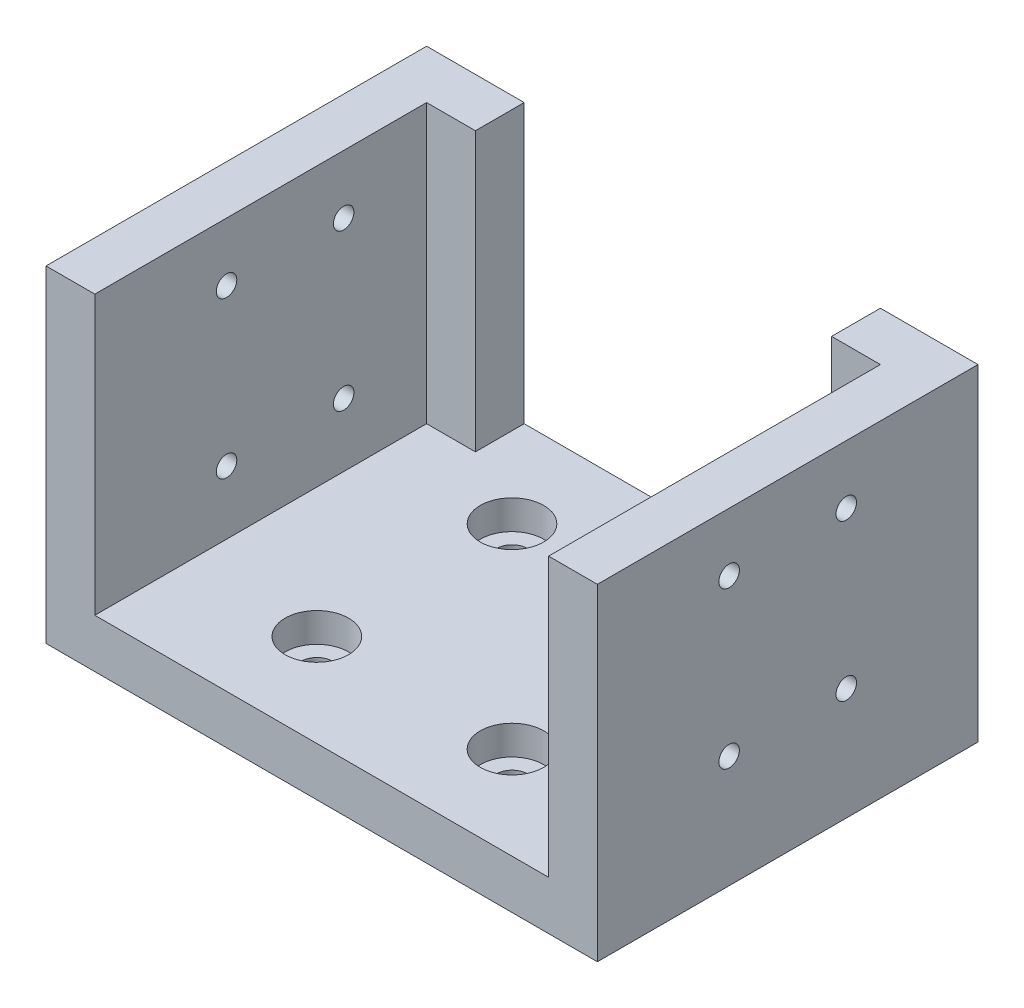
ISO-10303-21;
HEADER;
FILE_DESCRIPTION(('STEP AP214'),'2;1');
FILE_NAME('part.step','',(''),(''),'','','');
FILE_SCHEMA(('AUTOMOTIVE_DESIGN { 1 0 10303 214 1 1 1 1 }'));
ENDSEC;
DATA;
#1=APPLICATION_CONTEXT('core data for automotive mechanical design processes');
#2=APPLICATION_PROTOCOL_DEFINITION('international standard','automotive_design',2000,#1);
#3=PRODUCT_CONTEXT('',#1,'mechanical');
#4=PRODUCT('Part','Part','',(#3));
#5=PRODUCT_RELATED_PRODUCT_CATEGORY('part','',(#4));
#6=PRODUCT_DEFINITION_FORMATION('','',#4);
#7=PRODUCT_DEFINITION_CONTEXT('part definition',#1,'design');
#8=PRODUCT_DEFINITION('design','',#6,#7);
#9=PRODUCT_DEFINITION_SHAPE('','',#8);
#10=(LENGTH_UNIT() NAMED_UNIT(*) SI_UNIT(.MILLI.,.METRE.));
#11=(NAMED_UNIT(*) PLANE_ANGLE_UNIT() SI_UNIT($,.RADIAN.));
#12=(NAMED_UNIT(*) SI_UNIT($,.STERADIAN.) SOLID_ANGLE_UNIT());
#13=UNCERTAINTY_MEASURE_WITH_UNIT(LENGTH_MEASURE(1.E-05),#10,'distance_accuracy_value','');
#14=(GEOMETRIC_REPRESENTATION_CONTEXT(3) GLOBAL_UNCERTAINTY_ASSIGNED_CONTEXT((#13)) GLOBAL_UNIT_ASSIGNED_CONTEXT((#10,
#11,#12)) REPRESENTATION_CONTEXT('',''));
#15=CARTESIAN_POINT('',(0.,0.,0.));
#16=DIRECTION('',(0.,0.,1.));
#17=DIRECTION('',(1.,0.,0.));
#18=AXIS2_PLACEMENT_3D('',#15,#16,#17);
#19=CARTESIAN_POINT('',(0.,33.5,0.));
#20=DIRECTION('',(0.,1.,0.));
#21=DIRECTION('',(0.,0.,1.));
#22=AXIS2_PLACEMENT_3D('',#19,#20,#21);
#23=PLANE('',#22);
#24=DIRECTION('',(0.,0.,1.));
#25=VECTOR('',#24,1.);
#26=CARTESIAN_POINT('',(-18.25,33.5,-19.5));
#27=LINE('',#26,#25);
#28=CARTESIAN_POINT('',(-18.25,33.5,-19.5));
#29=VERTEX_POINT('',#28);
#30=CARTESIAN_POINT('',(-18.25,33.5,-14.5));
#31=VERTEX_POINT('',#30);
#32=EDGE_CURVE('E162',#29,#31,#27,.T.);
#33=ORIENTED_EDGE('',*,*,#32,.F.);
#34=DIRECTION('',(1.,0.,0.));
#35=VECTOR('',#34,1.);
#36=CARTESIAN_POINT('',(-28.25,33.5,-19.5));
#37=LINE('',#36,#35);
#38=CARTESIAN_POINT('',(-28.25,33.5,-19.5));
#39=VERTEX_POINT('',#38);
#40=EDGE_CURVE('E152',#39,#29,#37,.T.);
#41=ORIENTED_EDGE('',*,*,#40,.F.);
#42=DIRECTION('',(0.,0.,-1.));
#43=VECTOR('',#42,1.);
#44=CARTESIAN_POINT('',(-28.25,33.5,19.5));
#45=LINE('',#44,#43);
#46=CARTESIAN_POINT('',(-28.25,33.5,19.5));
#47=VERTEX_POINT('',#46);
#48=EDGE_CURVE('E248',#47,#39,#45,.T.);
#49=ORIENTED_EDGE('',*,*,#48,.F.);
#50=DIRECTION('',(1.,0.,0.));
#51=VECTOR('',#50,1.);
#52=CARTESIAN_POINT('',(-28.25,33.5,19.5));
#53=LINE('',#52,#51);
#54=CARTESIAN_POINT('',(-23.25,33.5,19.5));
#55=VERTEX_POINT('',#54);
#56=EDGE_CURVE('E245',#47,#55,#53,.T.);
#57=ORIENTED_EDGE('',*,*,#56,.T.);
#58=DIRECTION('',(0.,0.,1.));
#59=VECTOR('',#58,1.);
#60=CARTESIAN_POINT('',(-23.25,33.5,14.5));
#61=LINE('',#60,#59);
#62=CARTESIAN_POINT('',(-23.25,33.5,-14.5));
#63=VERTEX_POINT('',#62);
#64=EDGE_CURVE('E172',#63,#55,#61,.T.);
#65=ORIENTED_EDGE('',*,*,#64,.F.);
#66=DIRECTION('',(-1.,0.,0.));
#67=VECTOR('',#66,1.);
#68=CARTESIAN_POINT('',(23.25,33.5,-14.5));
#69=LINE('',#68,#67);
#70=EDGE_CURVE('E182',#31,#63,#69,.T.);
#71=ORIENTED_EDGE('',*,*,#70,.F.);
#72=EDGE_LOOP('',(#33,#41,#49,#57,#65,#71));
#73=FACE_BOUND('',#72,.T.);
#74=ADVANCED_FACE('F43',(#73),#23,.T.);
#75=CARTESIAN_POINT('',(23.25,5.,-14.5));
#76=DIRECTION('',(0.,0.,-1.));
#77=DIRECTION('',(-1.,0.,0.));
#78=AXIS2_PLACEMENT_3D('',#75,#76,#77);
#79=PLANE('',#78);
#80=DIRECTION('',(-1.,0.,0.));
#81=VECTOR('',#80,1.);
#82=CARTESIAN_POINT('',(23.25,5.,-14.5));
#83=LINE('',#82,#81);
#84=CARTESIAN_POINT('',(-18.25,5.,-14.5));
#85=VERTEX_POINT('',#84);
#86=CARTESIAN_POINT('',(-23.25,5.,-14.5));
#87=VERTEX_POINT('',#86);
#88=EDGE_CURVE('E171',#85,#87,#83,.T.);
#89=ORIENTED_EDGE('',*,*,#88,.F.);
#90=DIRECTION('',(0.,-1.,0.));
#91=VECTOR('',#90,1.);
#92=CARTESIAN_POINT('',(-18.25,33.5,-14.5));
#93=LINE('',#92,#91);
#94=EDGE_CURVE('E60',#31,#85,#93,.T.);
#95=ORIENTED_EDGE('',*,*,#94,.F.);
#96=ORIENTED_EDGE('',*,*,#70,.T.);
#97=DIRECTION('',(0.,1.,0.));
#98=VECTOR('',#97,1.);
#99=CARTESIAN_POINT('',(-23.25,5.,-14.5));
#100=LINE('',#99,#98);
#101=EDGE_CURVE('E192',#87,#63,#100,.T.);
#102=ORIENTED_EDGE('',*,*,#101,.F.);
#103=EDGE_LOOP('',(#89,#95,#96,#102));
#104=FACE_BOUND('',#103,.T.);
#105=ADVANCED_FACE('F321',(#104),#79,.F.);
#106=CARTESIAN_POINT('',(-28.25,11.5,6.));
#107=DIRECTION('',(1.,0.,0.));
#108=DIRECTION('',(0.,0.,-1.));
#109=AXIS2_PLACEMENT_3D('',#106,#107,#108);
#110=CYLINDRICAL_SURFACE('',#109,1.05);
#111=CARTESIAN_POINT('',(-23.25,11.5,6.));
#112=DIRECTION('',(-1.,0.,0.));
#113=DIRECTION('',(0.,0.,1.));
#114=AXIS2_PLACEMENT_3D('',#111,#112,#113);
#115=CIRCLE('',#114,1.05);
#116=CARTESIAN_POINT('',(-23.25,11.5,7.05));
#117=VERTEX_POINT('',#116);
#118=EDGE_CURVE('E211',#117,#117,#115,.F.);
#119=ORIENTED_EDGE('',*,*,#118,.T.);
#120=EDGE_LOOP('',(#119));
#121=FACE_BOUND('',#120,.T.);
#122=CARTESIAN_POINT('',(-28.25,11.5,6.));
#123=DIRECTION('',(1.,0.,0.));
#124=DIRECTION('',(0.,0.,-1.));
#125=AXIS2_PLACEMENT_3D('',#122,#123,#124);
#126=CIRCLE('',#125,1.05);
#127=CARTESIAN_POINT('',(-28.25,11.5,4.95));
#128=VERTEX_POINT('',#127);
#129=EDGE_CURVE('E233',#128,#128,#126,.T.);
#130=ORIENTED_EDGE('',*,*,#129,.F.);
#131=EDGE_LOOP('',(#130));
#132=FACE_BOUND('',#131,.T.);
#133=ADVANCED_FACE('F291',(#121,#132),#110,.F.);
#134=CARTESIAN_POINT('',(-28.25,11.5,-6.));
#135=DIRECTION('',(1.,0.,0.));
#136=DIRECTION('',(0.,0.,-1.));
#137=AXIS2_PLACEMENT_3D('',#134,#135,#136);
#138=CYLINDRICAL_SURFACE('',#137,1.05);
#139=CARTESIAN_POINT('',(-23.25,11.5,-6.));
#140=DIRECTION('',(-1.,0.,0.));
#141=DIRECTION('',(0.,0.,1.));
#142=AXIS2_PLACEMENT_3D('',#139,#140,#141);
#143=CIRCLE('',#142,1.05);
#144=CARTESIAN_POINT('',(-23.25,11.5,-4.95));
#145=VERTEX_POINT('',#144);
#146=EDGE_CURVE('E208',#145,#145,#143,.F.);
#147=ORIENTED_EDGE('',*,*,#146,.T.);
#148=EDGE_LOOP('',(#147));
#149=FACE_BOUND('',#148,.T.);
#150=CARTESIAN_POINT('',(-28.25,11.5,-6.));
#151=DIRECTION('',(1.,0.,0.));
#152=DIRECTION('',(0.,0.,1.));
#153=AXIS2_PLACEMENT_3D('',#150,#151,#152);
#154=CIRCLE('',#153,1.05);
#155=CARTESIAN_POINT('',(-28.25,11.5,-4.95));
#156=VERTEX_POINT('',#155);
#157=EDGE_CURVE('E219',#156,#156,#154,.T.);
#158=ORIENTED_EDGE('',*,*,#157,.F.);
#159=EDGE_LOOP('',(#158));
#160=FACE_BOUND('',#159,.T.);
#161=ADVANCED_FACE('F336',(#149,#160),#138,.F.);
#162=CARTESIAN_POINT('',(-28.25,27.5,-6.));
#163=DIRECTION('',(1.,0.,0.));
#164=DIRECTION('',(0.,0.,-1.));
#165=AXIS2_PLACEMENT_3D('',#162,#163,#164);
#166=CYLINDRICAL_SURFACE('',#165,1.05);
#167=CARTESIAN_POINT('',(-23.25,27.5,-6.));
#168=DIRECTION('',(-1.,0.,0.));
#169=DIRECTION('',(0.,0.,1.));
#170=AXIS2_PLACEMENT_3D('',#167,#168,#169);
#171=CIRCLE('',#170,1.05);
#172=CARTESIAN_POINT('',(-23.25,27.5,-4.95));
#173=VERTEX_POINT('',#172);
#174=EDGE_CURVE('E205',#173,#173,#171,.F.);
#175=ORIENTED_EDGE('',*,*,#174,.T.);
#176=EDGE_LOOP('',(#175));
#177=FACE_BOUND('',#176,.T.);
#178=CARTESIAN_POINT('',(-28.25,27.5,-6.));
#179=DIRECTION('',(1.,0.,0.));
#180=DIRECTION('',(0.,0.,-1.));
#181=AXIS2_PLACEMENT_3D('',#178,#179,#180);
#182=CIRCLE('',#181,1.05);
#183=CARTESIAN_POINT('',(-28.25,27.5,-7.05));
#184=VERTEX_POINT('',#183);
#185=EDGE_CURVE('E225',#184,#184,#182,.T.);
#186=ORIENTED_EDGE('',*,*,#185,.F.);
#187=EDGE_LOOP('',(#186));
#188=FACE_BOUND('',#187,.T.);
#189=ADVANCED_FACE('F467',(#177,#188),#166,.F.);
#190=CARTESIAN_POINT('',(-28.25,27.5,6.));
#191=DIRECTION('',(1.,0.,0.));
#192=DIRECTION('',(0.,0.,-1.));
#193=AXIS2_PLACEMENT_3D('',#190,#191,#192);
#194=CYLINDRICAL_SURFACE('',#193,1.05);
#195=CARTESIAN_POINT('',(-23.25,27.5,6.));
#196=DIRECTION('',(-1.,0.,0.));
#197=DIRECTION('',(0.,0.,1.));
#198=AXIS2_PLACEMENT_3D('',#195,#196,#197);
#199=CIRCLE('',#198,1.05);
#200=CARTESIAN_POINT('',(-23.25,27.5,7.05));
#201=VERTEX_POINT('',#200);
#202=EDGE_CURVE('E47',#201,#201,#199,.F.);
#203=ORIENTED_EDGE('',*,*,#202,.T.);
#204=EDGE_LOOP('',(#203));
#205=FACE_BOUND('',#204,.T.);
#206=CARTESIAN_POINT('',(-28.25,27.5,6.));
#207=DIRECTION('',(1.,0.,0.));
#208=DIRECTION('',(0.,0.,1.));
#209=AXIS2_PLACEMENT_3D('',#206,#207,#208);
#210=CIRCLE('',#209,1.05);
#211=CARTESIAN_POINT('',(-28.25,27.5,7.05));
#212=VERTEX_POINT('',#211);
#213=EDGE_CURVE('E214',#212,#212,#210,.T.);
#214=ORIENTED_EDGE('',*,*,#213,.F.);
#215=EDGE_LOOP('',(#214));
#216=FACE_BOUND('',#215,.T.);
#217=ADVANCED_FACE('F347',(#205,#216),#194,.F.);
#218=CARTESIAN_POINT('',(-28.25,33.5,-19.5));
#219=DIRECTION('',(0.,0.,-1.));
#220=DIRECTION('',(-1.,0.,0.));
#221=AXIS2_PLACEMENT_3D('',#218,#219,#220);
#222=PLANE('',#221);
#223=DIRECTION('',(0.,-1.,0.));
#224=VECTOR('',#223,1.);
#225=CARTESIAN_POINT('',(-18.25,33.5,-19.5));
#226=LINE('',#225,#224);
#227=CARTESIAN_POINT('',(-18.25,5.,-19.5));
#228=VERTEX_POINT('',#227);
#229=EDGE_CURVE('E135',#29,#228,#226,.T.);
#230=ORIENTED_EDGE('',*,*,#229,.T.);
#231=DIRECTION('',(1.,0.,0.));
#232=VECTOR('',#231,1.);
#233=CARTESIAN_POINT('',(-18.25,5.,-19.5));
#234=LINE('',#233,#232);
#235=CARTESIAN_POINT('',(18.25,5.,-19.5));
#236=VERTEX_POINT('',#235);
#237=EDGE_CURVE('E143',#228,#236,#234,.T.);
#238=ORIENTED_EDGE('',*,*,#237,.T.);
#239=DIRECTION('',(0.,1.,0.));
#240=VECTOR('',#239,1.);
#241=CARTESIAN_POINT('',(18.25,33.5,-19.5));
#242=LINE('',#241,#240);
#243=CARTESIAN_POINT('',(18.25,33.5,-19.5));
#244=VERTEX_POINT('',#243);
#245=EDGE_CURVE('E140',#236,#244,#242,.T.);
#246=ORIENTED_EDGE('',*,*,#245,.T.);
#247=CARTESIAN_POINT('',(28.25,33.5,-19.5));
#248=VERTEX_POINT('',#247);
#249=EDGE_CURVE('E241',#244,#248,#37,.T.);
#250=ORIENTED_EDGE('',*,*,#249,.T.);
#251=DIRECTION('',(0.,-1.,0.));
#252=VECTOR('',#251,1.);
#253=CARTESIAN_POINT('',(28.25,33.5,-19.5));
#254=LINE('',#253,#252);
#255=CARTESIAN_POINT('',(28.25,0.,-19.5));
#256=VERTEX_POINT('',#255);
#257=EDGE_CURVE('E251',#248,#256,#254,.T.);
#258=ORIENTED_EDGE('',*,*,#257,.T.);
#259=DIRECTION('',(1.,0.,0.));
#260=VECTOR('',#259,1.);
#261=CARTESIAN_POINT('',(-28.25,0.,-19.5));
#262=LINE('',#261,#260);
#263=CARTESIAN_POINT('',(-28.25,0.,-19.5));
#264=VERTEX_POINT('',#263);
#265=EDGE_CURVE('E236',#264,#256,#262,.T.);
#266=ORIENTED_EDGE('',*,*,#265,.F.);
#267=DIRECTION('',(0.,-1.,0.));
#268=VECTOR('',#267,1.);
#269=CARTESIAN_POINT('',(-28.25,33.5,-19.5));
#270=LINE('',#269,#268);
#271=EDGE_CURVE('E11',#39,#264,#270,.T.);
#272=ORIENTED_EDGE('',*,*,#271,.F.);
#273=ORIENTED_EDGE('',*,*,#40,.T.);
#274=EDGE_LOOP('',(#230,#238,#246,#250,#258,#266,#272,#273));
#275=FACE_BOUND('',#274,.T.);
#276=ADVANCED_FACE('F45',(#275),#222,.T.);
#277=CARTESIAN_POINT('',(-28.25,33.5,19.5));
#278=DIRECTION('',(-1.,0.,0.));
#279=DIRECTION('',(0.,0.,1.));
#280=AXIS2_PLACEMENT_3D('',#277,#278,#279);
#281=PLANE('',#280);
#282=ORIENTED_EDGE('',*,*,#213,.T.);
#283=EDGE_LOOP('',(#282));
#284=FACE_BOUND('',#283,.T.);
#285=ORIENTED_EDGE('',*,*,#185,.T.);
#286=EDGE_LOOP('',(#285));
#287=FACE_BOUND('',#286,.T.);
#288=ORIENTED_EDGE('',*,*,#157,.T.);
#289=EDGE_LOOP('',(#288));
#290=FACE_BOUND('',#289,.T.);
#291=ORIENTED_EDGE('',*,*,#129,.T.);
#292=EDGE_LOOP('',(#291));
#293=FACE_BOUND('',#292,.T.);
#294=DIRECTION('',(0.,0.,-1.));
#295=VECTOR('',#294,1.);
#296=CARTESIAN_POINT('',(-28.25,0.,19.5));
#297=LINE('',#296,#295);
#298=CARTESIAN_POINT('',(-28.25,0.,19.5));
#299=VERTEX_POINT('',#298);
#300=EDGE_CURVE('E259',#299,#264,#297,.T.);
#301=ORIENTED_EDGE('',*,*,#300,.F.);
#302=DIRECTION('',(0.,-1.,0.));
#303=VECTOR('',#302,1.);
#304=CARTESIAN_POINT('',(-28.25,33.5,19.5));
#305=LINE('',#304,#303);
#306=EDGE_CURVE('E52',#47,#299,#305,.T.);
#307=ORIENTED_EDGE('',*,*,#306,.F.);
#308=ORIENTED_EDGE('',*,*,#48,.T.);
#309=ORIENTED_EDGE('',*,*,#271,.T.);
#310=EDGE_LOOP('',(#301,#307,#308,#309));
#311=FACE_BOUND('',#310,.T.);
#312=ADVANCED_FACE('F315',(#284,#287,#290,#293,#311),#281,.T.);
#313=CARTESIAN_POINT('',(-28.25,33.5,19.5));
#314=DIRECTION('',(0.,0.,-1.));
#315=DIRECTION('',(-1.,0.,0.));
#316=AXIS2_PLACEMENT_3D('',#313,#314,#315);
#317=PLANE('',#316);
#318=DIRECTION('',(1.,0.,0.));
#319=VECTOR('',#318,1.);
#320=CARTESIAN_POINT('',(-23.25,5.,19.5));
#321=LINE('',#320,#319);
#322=CARTESIAN_POINT('',(-23.25,5.,19.5));
#323=VERTEX_POINT('',#322);
#324=CARTESIAN_POINT('',(23.25,5.,19.5));
#325=VERTEX_POINT('',#324);
#326=EDGE_CURVE('E177',#323,#325,#321,.T.);
#327=ORIENTED_EDGE('',*,*,#326,.F.);
#328=DIRECTION('',(0.,1.,0.));
#329=VECTOR('',#328,1.);
#330=CARTESIAN_POINT('',(-23.25,5.,19.5));
#331=LINE('',#330,#329);
#332=EDGE_CURVE('E189',#323,#55,#331,.T.);
#333=ORIENTED_EDGE('',*,*,#332,.T.);
#334=ORIENTED_EDGE('',*,*,#56,.F.);
#335=ORIENTED_EDGE('',*,*,#306,.T.);
#336=DIRECTION('',(1.,0.,0.));
#337=VECTOR('',#336,1.);
#338=CARTESIAN_POINT('',(-28.25,0.,19.5));
#339=LINE('',#338,#337);
#340=CARTESIAN_POINT('',(28.25,0.,19.5));
#341=VERTEX_POINT('',#340);
#342=EDGE_CURVE('E257',#299,#341,#339,.T.);
#343=ORIENTED_EDGE('',*,*,#342,.T.);
#344=DIRECTION('',(0.,-1.,0.));
#345=VECTOR('',#344,1.);
#346=CARTESIAN_POINT('',(28.25,33.5,19.5));
#347=LINE('',#346,#345);
#348=CARTESIAN_POINT('',(28.25,33.5,19.5));
#349=VERTEX_POINT('',#348);
#350=EDGE_CURVE('E263',#349,#341,#347,.T.);
#351=ORIENTED_EDGE('',*,*,#350,.F.);
#352=CARTESIAN_POINT('',(23.25,33.5,19.5));
#353=VERTEX_POINT('',#352);
#354=EDGE_CURVE('E244',#353,#349,#53,.T.);
#355=ORIENTED_EDGE('',*,*,#354,.F.);
#356=DIRECTION('',(0.,1.,0.));
#357=VECTOR('',#356,1.);
#358=CARTESIAN_POINT('',(23.25,5.,19.5));
#359=LINE('',#358,#357);
#360=EDGE_CURVE('E68',#325,#353,#359,.T.);
#361=ORIENTED_EDGE('',*,*,#360,.F.);
#362=EDGE_LOOP('',(#327,#333,#334,#335,#343,#351,#355,#361));
#363=FACE_BOUND('',#362,.T.);
#364=ADVANCED_FACE('F298',(#363),#317,.F.);
#365=CARTESIAN_POINT('',(28.25,33.5,19.5));
#366=DIRECTION('',(-1.,0.,0.));
#367=DIRECTION('',(0.,0.,1.));
#368=AXIS2_PLACEMENT_3D('',#365,#366,#367);
#369=PLANE('',#368);
#370=CARTESIAN_POINT('',(28.25,27.5,6.));
#371=DIRECTION('',(1.,0.,0.));
#372=DIRECTION('',(0.,0.,1.));
#373=AXIS2_PLACEMENT_3D('',#370,#371,#372);
#374=CIRCLE('',#373,1.05);
#375=CARTESIAN_POINT('',(28.25,27.5,7.05));
#376=VERTEX_POINT('',#375);
#377=EDGE_CURVE('E228',#376,#376,#374,.T.);
#378=ORIENTED_EDGE('',*,*,#377,.F.);
#379=EDGE_LOOP('',(#378));
#380=FACE_BOUND('',#379,.T.);
#381=CARTESIAN_POINT('',(28.25,27.5,-6.));
#382=DIRECTION('',(1.,0.,0.));
#383=DIRECTION('',(0.,0.,-1.));
#384=AXIS2_PLACEMENT_3D('',#381,#382,#383);
#385=CIRCLE('',#384,1.05);
#386=CARTESIAN_POINT('',(28.25,27.5,-7.05));
#387=VERTEX_POINT('',#386);
#388=EDGE_CURVE('E222',#387,#387,#385,.T.);
#389=ORIENTED_EDGE('',*,*,#388,.F.);
#390=EDGE_LOOP('',(#389));
#391=FACE_BOUND('',#390,.T.);
#392=CARTESIAN_POINT('',(28.25,11.5,-6.));
#393=DIRECTION('',(1.,0.,0.));
#394=DIRECTION('',(0.,0.,1.));
#395=AXIS2_PLACEMENT_3D('',#392,#393,#394);
#396=CIRCLE('',#395,1.05);
#397=CARTESIAN_POINT('',(28.25,11.5,-4.95));
#398=VERTEX_POINT('',#397);
#399=EDGE_CURVE('E215',#398,#398,#396,.T.);
#400=ORIENTED_EDGE('',*,*,#399,.F.);
#401=EDGE_LOOP('',(#400));
#402=FACE_BOUND('',#401,.T.);
#403=CARTESIAN_POINT('',(28.25,11.5,6.));
#404=DIRECTION('',(1.,0.,0.));
#405=DIRECTION('',(0.,0.,-1.));
#406=AXIS2_PLACEMENT_3D('',#403,#404,#405);
#407=CIRCLE('',#406,1.05);
#408=CARTESIAN_POINT('',(28.25,11.5,4.95));
#409=VERTEX_POINT('',#408);
#410=EDGE_CURVE('E218',#409,#409,#407,.T.);
#411=ORIENTED_EDGE('',*,*,#410,.F.);
#412=EDGE_LOOP('',(#411));
#413=FACE_BOUND('',#412,.T.);
#414=DIRECTION('',(0.,0.,-1.));
#415=VECTOR('',#414,1.);
#416=CARTESIAN_POINT('',(28.25,0.,19.5));
#417=LINE('',#416,#415);
#418=EDGE_CURVE('E254',#341,#256,#417,.T.);
#419=ORIENTED_EDGE('',*,*,#418,.T.);
#420=ORIENTED_EDGE('',*,*,#257,.F.);
#421=DIRECTION('',(0.,0.,-1.));
#422=VECTOR('',#421,1.);
#423=CARTESIAN_POINT('',(28.25,33.5,19.5));
#424=LINE('',#423,#422);
#425=EDGE_CURVE('E240',#349,#248,#424,.T.);
#426=ORIENTED_EDGE('',*,*,#425,.F.);
#427=ORIENTED_EDGE('',*,*,#350,.T.);
#428=EDGE_LOOP('',(#419,#420,#426,#427));
#429=FACE_BOUND('',#428,.T.);
#430=ADVANCED_FACE('F294',(#380,#391,#402,#413,#429),#369,.F.);
#431=DIRECTION('',(0.,0.,1.));
#432=VECTOR('',#431,1.);
#433=CARTESIAN_POINT('',(18.25,33.5,-19.5));
#434=LINE('',#433,#432);
#435=CARTESIAN_POINT('',(18.25,33.5,-14.5));
#436=VERTEX_POINT('',#435);
#437=EDGE_CURVE('E165',#244,#436,#434,.T.);
#438=ORIENTED_EDGE('',*,*,#437,.T.);
#439=CARTESIAN_POINT('',(23.25,33.5,-14.5));
#440=VERTEX_POINT('',#439);
#441=EDGE_CURVE('E183',#440,#436,#69,.T.);
#442=ORIENTED_EDGE('',*,*,#441,.F.);
#443=DIRECTION('',(0.,0.,-1.));
#444=VECTOR('',#443,1.);
#445=CARTESIAN_POINT('',(23.25,33.5,14.5));
#446=LINE('',#445,#444);
#447=EDGE_CURVE('E164',#353,#440,#446,.T.);
#448=ORIENTED_EDGE('',*,*,#447,.F.);
#449=ORIENTED_EDGE('',*,*,#354,.T.);
#450=ORIENTED_EDGE('',*,*,#425,.T.);
#451=ORIENTED_EDGE('',*,*,#249,.F.);
#452=EDGE_LOOP('',(#438,#442,#448,#449,#450,#451));
#453=FACE_BOUND('',#452,.T.);
#454=ADVANCED_FACE('F297',(#453),#23,.T.);
#455=CARTESIAN_POINT('',(0.,0.,0.));
#456=DIRECTION('',(0.,1.,0.));
#457=DIRECTION('',(0.,0.,1.));
#458=AXIS2_PLACEMENT_3D('',#455,#456,#457);
#459=PLANE('',#458);
#460=CARTESIAN_POINT('',(10.,0.,-10.));
#461=DIRECTION('',(0.,1.,0.));
#462=DIRECTION('',(0.,0.,1.));
#463=AXIS2_PLACEMENT_3D('',#460,#461,#462);
#464=CIRCLE('',#463,1.6);
#465=CARTESIAN_POINT('',(10.,0.,-8.4));
#466=VERTEX_POINT('',#465);
#467=EDGE_CURVE('E369',#466,#466,#464,.T.);
#468=ORIENTED_EDGE('',*,*,#467,.T.);
#469=EDGE_LOOP('',(#468));
#470=FACE_BOUND('',#469,.T.);
#471=CARTESIAN_POINT('',(10.,0.,10.));
#472=DIRECTION('',(0.,1.,0.));
#473=DIRECTION('',(0.,0.,1.));
#474=AXIS2_PLACEMENT_3D('',#471,#472,#473);
#475=CIRCLE('',#474,1.6);
#476=CARTESIAN_POINT('',(10.,0.,11.6));
#477=VERTEX_POINT('',#476);
#478=EDGE_CURVE('E373',#477,#477,#475,.T.);
#479=ORIENTED_EDGE('',*,*,#478,.T.);
#480=EDGE_LOOP('',(#479));
#481=FACE_BOUND('',#480,.T.);
#482=CARTESIAN_POINT('',(-10.,0.,10.));
#483=DIRECTION('',(0.,1.,0.));
#484=DIRECTION('',(0.,0.,1.));
#485=AXIS2_PLACEMENT_3D('',#482,#483,#484);
#486=CIRCLE('',#485,1.6);
#487=CARTESIAN_POINT('',(-10.,0.,11.6));
#488=VERTEX_POINT('',#487);
#489=EDGE_CURVE('E377',#488,#488,#486,.T.);
#490=ORIENTED_EDGE('',*,*,#489,.T.);
#491=EDGE_LOOP('',(#490));
#492=FACE_BOUND('',#491,.T.);
#493=CARTESIAN_POINT('',(-10.,0.,-10.));
#494=DIRECTION('',(0.,1.,0.));
#495=DIRECTION('',(0.,0.,1.));
#496=AXIS2_PLACEMENT_3D('',#493,#494,#495);
#497=CIRCLE('',#496,1.6);
#498=CARTESIAN_POINT('',(-10.,0.,-8.4));
#499=VERTEX_POINT('',#498);
#500=EDGE_CURVE('E157',#499,#499,#497,.T.);
#501=ORIENTED_EDGE('',*,*,#500,.T.);
#502=EDGE_LOOP('',(#501));
#503=FACE_BOUND('',#502,.T.);
#504=ORIENTED_EDGE('',*,*,#265,.T.);
#505=ORIENTED_EDGE('',*,*,#418,.F.);
#506=ORIENTED_EDGE('',*,*,#342,.F.);
#507=ORIENTED_EDGE('',*,*,#300,.T.);
#508=EDGE_LOOP('',(#504,#505,#506,#507));
#509=FACE_BOUND('',#508,.T.);
#510=ADVANCED_FACE('F289',(#470,#481,#492,#503,#509),#459,.F.);
#511=CARTESIAN_POINT('',(23.25,11.5,6.));
#512=DIRECTION('',(1.,0.,0.));
#513=DIRECTION('',(0.,0.,-1.));
#514=AXIS2_PLACEMENT_3D('',#511,#512,#513);
#515=CIRCLE('',#514,1.05);
#516=CARTESIAN_POINT('',(23.25,11.5,4.95));
#517=VERTEX_POINT('',#516);
#518=EDGE_CURVE('E202',#517,#517,#515,.F.);
#519=ORIENTED_EDGE('',*,*,#518,.T.);
#520=EDGE_LOOP('',(#519));
#521=FACE_BOUND('',#520,.T.);
#522=ORIENTED_EDGE('',*,*,#410,.T.);
#523=EDGE_LOOP('',(#522));
#524=FACE_BOUND('',#523,.T.);
#525=ADVANCED_FACE('F285',(#521,#524),#110,.F.);
#526=CARTESIAN_POINT('',(23.25,11.5,-6.));
#527=DIRECTION('',(1.,0.,0.));
#528=DIRECTION('',(0.,0.,-1.));
#529=AXIS2_PLACEMENT_3D('',#526,#527,#528);
#530=CIRCLE('',#529,1.05);
#531=CARTESIAN_POINT('',(23.25,11.5,-7.05));
#532=VERTEX_POINT('',#531);
#533=EDGE_CURVE('E199',#532,#532,#530,.F.);
#534=ORIENTED_EDGE('',*,*,#533,.T.);
#535=EDGE_LOOP('',(#534));
#536=FACE_BOUND('',#535,.T.);
#537=ORIENTED_EDGE('',*,*,#399,.T.);
#538=EDGE_LOOP('',(#537));
#539=FACE_BOUND('',#538,.T.);
#540=ADVANCED_FACE('F288',(#536,#539),#138,.F.);
#541=CARTESIAN_POINT('',(23.25,27.5,-6.));
#542=DIRECTION('',(1.,0.,0.));
#543=DIRECTION('',(0.,0.,-1.));
#544=AXIS2_PLACEMENT_3D('',#541,#542,#543);
#545=CIRCLE('',#544,1.05);
#546=CARTESIAN_POINT('',(23.25,27.5,-7.05));
#547=VERTEX_POINT('',#546);
#548=EDGE_CURVE('E196',#547,#547,#545,.F.);
#549=ORIENTED_EDGE('',*,*,#548,.T.);
#550=EDGE_LOOP('',(#549));
#551=FACE_BOUND('',#550,.T.);
#552=ORIENTED_EDGE('',*,*,#388,.T.);
#553=EDGE_LOOP('',(#552));
#554=FACE_BOUND('',#553,.T.);
#555=ADVANCED_FACE('F462',(#551,#554),#166,.F.);
#556=CARTESIAN_POINT('',(23.25,27.5,6.));
#557=DIRECTION('',(1.,0.,0.));
#558=DIRECTION('',(0.,0.,-1.));
#559=AXIS2_PLACEMENT_3D('',#556,#557,#558);
#560=CIRCLE('',#559,1.05);
#561=CARTESIAN_POINT('',(23.25,27.5,4.95));
#562=VERTEX_POINT('',#561);
#563=EDGE_CURVE('E188',#562,#562,#560,.F.);
#564=ORIENTED_EDGE('',*,*,#563,.T.);
#565=EDGE_LOOP('',(#564));
#566=FACE_BOUND('',#565,.T.);
#567=ORIENTED_EDGE('',*,*,#377,.T.);
#568=EDGE_LOOP('',(#567));
#569=FACE_BOUND('',#568,.T.);
#570=ADVANCED_FACE('F269',(#566,#569),#194,.F.);
#571=CARTESIAN_POINT('',(-23.25,5.,14.5));
#572=DIRECTION('',(-1.,0.,0.));
#573=DIRECTION('',(0.,0.,1.));
#574=AXIS2_PLACEMENT_3D('',#571,#572,#573);
#575=PLANE('',#574);
#576=ORIENTED_EDGE('',*,*,#146,.F.);
#577=EDGE_LOOP('',(#576));
#578=FACE_BOUND('',#577,.T.);
#579=ORIENTED_EDGE('',*,*,#202,.F.);
#580=EDGE_LOOP('',(#579));
#581=FACE_BOUND('',#580,.T.);
#582=ORIENTED_EDGE('',*,*,#64,.T.);
#583=ORIENTED_EDGE('',*,*,#332,.F.);
#584=DIRECTION('',(0.,0.,1.));
#585=VECTOR('',#584,1.);
#586=CARTESIAN_POINT('',(-23.25,5.,-14.5));
#587=LINE('',#586,#585);
#588=EDGE_CURVE('E175',#87,#323,#587,.T.);
#589=ORIENTED_EDGE('',*,*,#588,.F.);
#590=ORIENTED_EDGE('',*,*,#101,.T.);
#591=EDGE_LOOP('',(#582,#583,#589,#590));
#592=FACE_BOUND('',#591,.T.);
#593=ORIENTED_EDGE('',*,*,#174,.F.);
#594=EDGE_LOOP('',(#593));
#595=FACE_BOUND('',#594,.T.);
#596=ORIENTED_EDGE('',*,*,#118,.F.);
#597=EDGE_LOOP('',(#596));
#598=FACE_BOUND('',#597,.T.);
#599=ADVANCED_FACE('F275',(#578,#581,#592,#595,#598),#575,.F.);
#600=CARTESIAN_POINT('',(23.25,5.,14.5));
#601=DIRECTION('',(1.,0.,0.));
#602=DIRECTION('',(0.,0.,-1.));
#603=AXIS2_PLACEMENT_3D('',#600,#601,#602);
#604=PLANE('',#603);
#605=ORIENTED_EDGE('',*,*,#533,.F.);
#606=EDGE_LOOP('',(#605));
#607=FACE_BOUND('',#606,.T.);
#608=ORIENTED_EDGE('',*,*,#563,.F.);
#609=EDGE_LOOP('',(#608));
#610=FACE_BOUND('',#609,.T.);
#611=ORIENTED_EDGE('',*,*,#447,.T.);
#612=DIRECTION('',(0.,1.,0.));
#613=VECTOR('',#612,1.);
#614=CARTESIAN_POINT('',(23.25,5.,-14.5));
#615=LINE('',#614,#613);
#616=CARTESIAN_POINT('',(23.25,5.,-14.5));
#617=VERTEX_POINT('',#616);
#618=EDGE_CURVE('E180',#617,#440,#615,.T.);
#619=ORIENTED_EDGE('',*,*,#618,.F.);
#620=DIRECTION('',(0.,0.,-1.));
#621=VECTOR('',#620,1.);
#622=CARTESIAN_POINT('',(23.25,5.,14.5));
#623=LINE('',#622,#621);
#624=EDGE_CURVE('E169',#325,#617,#623,.T.);
#625=ORIENTED_EDGE('',*,*,#624,.F.);
#626=ORIENTED_EDGE('',*,*,#360,.T.);
#627=EDGE_LOOP('',(#611,#619,#625,#626));
#628=FACE_BOUND('',#627,.T.);
#629=ORIENTED_EDGE('',*,*,#548,.F.);
#630=EDGE_LOOP('',(#629));
#631=FACE_BOUND('',#630,.T.);
#632=ORIENTED_EDGE('',*,*,#518,.F.);
#633=EDGE_LOOP('',(#632));
#634=FACE_BOUND('',#633,.T.);
#635=ADVANCED_FACE('F272',(#607,#610,#628,#631,#634),#604,.F.);
#636=ORIENTED_EDGE('',*,*,#441,.T.);
#637=DIRECTION('',(0.,1.,0.));
#638=VECTOR('',#637,1.);
#639=CARTESIAN_POINT('',(18.25,33.5,-14.5));
#640=LINE('',#639,#638);
#641=CARTESIAN_POINT('',(18.25,5.,-14.5));
#642=VERTEX_POINT('',#641);
#643=EDGE_CURVE('E153',#642,#436,#640,.T.);
#644=ORIENTED_EDGE('',*,*,#643,.F.);
#645=EDGE_CURVE('E173',#617,#642,#83,.T.);
#646=ORIENTED_EDGE('',*,*,#645,.F.);
#647=ORIENTED_EDGE('',*,*,#618,.T.);
#648=EDGE_LOOP('',(#636,#644,#646,#647));
#649=FACE_BOUND('',#648,.T.);
#650=ADVANCED_FACE('F274',(#649),#79,.F.);
#651=CARTESIAN_POINT('',(0.,5.,0.));
#652=DIRECTION('',(0.,1.,0.));
#653=DIRECTION('',(0.,0.,1.));
#654=AXIS2_PLACEMENT_3D('',#651,#652,#653);
#655=PLANE('',#654);
#656=CARTESIAN_POINT('',(10.,5.,-10.));
#657=DIRECTION('',(0.,1.,0.));
#658=DIRECTION('',(0.,0.,1.));
#659=AXIS2_PLACEMENT_3D('',#656,#657,#658);
#660=CIRCLE('',#659,3.25);
#661=CARTESIAN_POINT('',(10.,5.,-6.75));
#662=VERTEX_POINT('',#661);
#663=EDGE_CURVE('E419',#662,#662,#660,.T.);
#664=ORIENTED_EDGE('',*,*,#663,.F.);
#665=EDGE_LOOP('',(#664));
#666=FACE_BOUND('',#665,.T.);
#667=CARTESIAN_POINT('',(10.,5.,10.));
#668=DIRECTION('',(0.,1.,0.));
#669=DIRECTION('',(0.,0.,1.));
#670=AXIS2_PLACEMENT_3D('',#667,#668,#669);
#671=CIRCLE('',#670,3.25);
#672=CARTESIAN_POINT('',(10.,5.,13.25));
#673=VERTEX_POINT('',#672);
#674=EDGE_CURVE('E409',#673,#673,#671,.T.);
#675=ORIENTED_EDGE('',*,*,#674,.F.);
#676=EDGE_LOOP('',(#675));
#677=FACE_BOUND('',#676,.T.);
#678=CARTESIAN_POINT('',(-10.,5.,10.));
#679=DIRECTION('',(0.,1.,0.));
#680=DIRECTION('',(0.,0.,1.));
#681=AXIS2_PLACEMENT_3D('',#678,#679,#680);
#682=CIRCLE('',#681,3.25);
#683=CARTESIAN_POINT('',(-10.,5.,13.25));
#684=VERTEX_POINT('',#683);
#685=EDGE_CURVE('E399',#684,#684,#682,.T.);
#686=ORIENTED_EDGE('',*,*,#685,.F.);
#687=EDGE_LOOP('',(#686));
#688=FACE_BOUND('',#687,.T.);
#689=CARTESIAN_POINT('',(-10.,5.,-10.));
#690=DIRECTION('',(0.,1.,0.));
#691=DIRECTION('',(0.,0.,1.));
#692=AXIS2_PLACEMENT_3D('',#689,#690,#691);
#693=CIRCLE('',#692,3.25);
#694=CARTESIAN_POINT('',(-10.,5.,-6.75));
#695=VERTEX_POINT('',#694);
#696=EDGE_CURVE('E387',#695,#695,#693,.T.);
#697=ORIENTED_EDGE('',*,*,#696,.F.);
#698=EDGE_LOOP('',(#697));
#699=FACE_BOUND('',#698,.T.);
#700=ORIENTED_EDGE('',*,*,#624,.T.);
#701=ORIENTED_EDGE('',*,*,#645,.T.);
#702=DIRECTION('',(0.,0.,1.));
#703=VECTOR('',#702,1.);
#704=CARTESIAN_POINT('',(18.25,5.,-19.5));
#705=LINE('',#704,#703);
#706=EDGE_CURVE('E139',#236,#642,#705,.T.);
#707=ORIENTED_EDGE('',*,*,#706,.F.);
#708=ORIENTED_EDGE('',*,*,#237,.F.);
#709=DIRECTION('',(0.,0.,1.));
#710=VECTOR('',#709,1.);
#711=CARTESIAN_POINT('',(-18.25,5.,-19.5));
#712=LINE('',#711,#710);
#713=EDGE_CURVE('E131',#228,#85,#712,.T.);
#714=ORIENTED_EDGE('',*,*,#713,.T.);
#715=ORIENTED_EDGE('',*,*,#88,.T.);
#716=ORIENTED_EDGE('',*,*,#588,.T.);
#717=ORIENTED_EDGE('',*,*,#326,.T.);
#718=EDGE_LOOP('',(#700,#701,#707,#708,#714,#715,#716,#717));
#719=FACE_BOUND('',#718,.T.);
#720=ADVANCED_FACE('F144',(#666,#677,#688,#699,#719),#655,.T.);
#721=CARTESIAN_POINT('',(-18.25,33.5,-19.5));
#722=DIRECTION('',(-1.,0.,0.));
#723=DIRECTION('',(0.,-1.,0.));
#724=AXIS2_PLACEMENT_3D('',#721,#722,#723);
#725=PLANE('',#724);
#726=ORIENTED_EDGE('',*,*,#94,.T.);
#727=ORIENTED_EDGE('',*,*,#713,.F.);
#728=ORIENTED_EDGE('',*,*,#229,.F.);
#729=ORIENTED_EDGE('',*,*,#32,.T.);
#730=EDGE_LOOP('',(#726,#727,#728,#729));
#731=FACE_BOUND('',#730,.T.);
#732=ADVANCED_FACE('F133',(#731),#725,.F.);
#733=CARTESIAN_POINT('',(18.25,33.5,-19.5));
#734=DIRECTION('',(1.,0.,0.));
#735=DIRECTION('',(0.,1.,0.));
#736=AXIS2_PLACEMENT_3D('',#733,#734,#735);
#737=PLANE('',#736);
#738=ORIENTED_EDGE('',*,*,#643,.T.);
#739=ORIENTED_EDGE('',*,*,#437,.F.);
#740=ORIENTED_EDGE('',*,*,#245,.F.);
#741=ORIENTED_EDGE('',*,*,#706,.T.);
#742=EDGE_LOOP('',(#738,#739,#740,#741));
#743=FACE_BOUND('',#742,.T.);
#744=ADVANCED_FACE('F454',(#743),#737,.F.);
#745=CARTESIAN_POINT('',(-10.,5.,-10.));
#746=DIRECTION('',(0.,1.,0.));
#747=DIRECTION('',(0.,0.,1.));
#748=AXIS2_PLACEMENT_3D('',#745,#746,#747);
#749=CYLINDRICAL_SURFACE('',#748,1.60000000000001);
#750=ORIENTED_EDGE('',*,*,#500,.F.);
#751=EDGE_LOOP('',(#750));
#752=FACE_BOUND('',#751,.T.);
#753=CARTESIAN_POINT('',(-10.,2.,-10.));
#754=DIRECTION('',(0.,1.,0.));
#755=DIRECTION('',(0.,0.,1.));
#756=AXIS2_PLACEMENT_3D('',#753,#754,#755);
#757=CIRCLE('',#756,1.60000000000001);
#758=CARTESIAN_POINT('',(-10.,2.,-8.39999999999999));
#759=VERTEX_POINT('',#758);
#760=EDGE_CURVE('E381',#759,#759,#757,.T.);
#761=ORIENTED_EDGE('',*,*,#760,.T.);
#762=EDGE_LOOP('',(#761));
#763=FACE_BOUND('',#762,.T.);
#764=ADVANCED_FACE('F446',(#752,#763),#749,.F.);
#765=CARTESIAN_POINT('',(-8.39999999999999,2.,-10.));
#766=DIRECTION('',(0.,-1.,0.));
#767=DIRECTION('',(0.,0.,-1.));
#768=AXIS2_PLACEMENT_3D('',#765,#766,#767);
#769=PLANE('',#768);
#770=ORIENTED_EDGE('',*,*,#760,.F.);
#771=EDGE_LOOP('',(#770));
#772=FACE_BOUND('',#771,.T.);
#773=CARTESIAN_POINT('',(-10.,2.,-10.));
#774=DIRECTION('',(0.,1.,0.));
#775=DIRECTION('',(0.,0.,1.));
#776=AXIS2_PLACEMENT_3D('',#773,#774,#775);
#777=CIRCLE('',#776,3.25);
#778=CARTESIAN_POINT('',(-10.,2.,-6.75));
#779=VERTEX_POINT('',#778);
#780=EDGE_CURVE('E383',#779,#779,#777,.T.);
#781=ORIENTED_EDGE('',*,*,#780,.T.);
#782=EDGE_LOOP('',(#781));
#783=FACE_BOUND('',#782,.T.);
#784=ADVANCED_FACE('F436',(#772,#783),#769,.F.);
#785=CARTESIAN_POINT('',(-10.,5.,-10.));
#786=DIRECTION('',(0.,1.,0.));
#787=DIRECTION('',(0.,0.,1.));
#788=AXIS2_PLACEMENT_3D('',#785,#786,#787);
#789=CYLINDRICAL_SURFACE('',#788,3.25);
#790=ORIENTED_EDGE('',*,*,#780,.F.);
#791=EDGE_LOOP('',(#790));
#792=FACE_BOUND('',#791,.T.);
#793=ORIENTED_EDGE('',*,*,#696,.T.);
#794=EDGE_LOOP('',(#793));
#795=FACE_BOUND('',#794,.T.);
#796=ADVANCED_FACE('F433',(#792,#795),#789,.F.);
#797=CARTESIAN_POINT('',(-10.,5.,10.));
#798=DIRECTION('',(0.,1.,0.));
#799=DIRECTION('',(0.,0.,1.));
#800=AXIS2_PLACEMENT_3D('',#797,#798,#799);
#801=CYLINDRICAL_SURFACE('',#800,1.60000000000001);
#802=ORIENTED_EDGE('',*,*,#489,.F.);
#803=EDGE_LOOP('',(#802));
#804=FACE_BOUND('',#803,.T.);
#805=CARTESIAN_POINT('',(-10.,2.,10.));
#806=DIRECTION('',(0.,1.,0.));
#807=DIRECTION('',(0.,0.,1.));
#808=AXIS2_PLACEMENT_3D('',#805,#806,#807);
#809=CIRCLE('',#808,1.60000000000001);
#810=CARTESIAN_POINT('',(-10.,2.,11.6));
#811=VERTEX_POINT('',#810);
#812=EDGE_CURVE('E393',#811,#811,#809,.T.);
#813=ORIENTED_EDGE('',*,*,#812,.T.);
#814=EDGE_LOOP('',(#813));
#815=FACE_BOUND('',#814,.T.);
#816=ADVANCED_FACE('F435',(#804,#815),#801,.F.);
#817=CARTESIAN_POINT('',(-8.39999999999999,2.,10.));
#818=DIRECTION('',(0.,-1.,0.));
#819=DIRECTION('',(0.,0.,-1.));
#820=AXIS2_PLACEMENT_3D('',#817,#818,#819);
#821=PLANE('',#820);
#822=ORIENTED_EDGE('',*,*,#812,.F.);
#823=EDGE_LOOP('',(#822));
#824=FACE_BOUND('',#823,.T.);
#825=CARTESIAN_POINT('',(-10.,2.,10.));
#826=DIRECTION('',(0.,1.,0.));
#827=DIRECTION('',(0.,0.,1.));
#828=AXIS2_PLACEMENT_3D('',#825,#826,#827);
#829=CIRCLE('',#828,3.25);
#830=CARTESIAN_POINT('',(-10.,2.,13.25));
#831=VERTEX_POINT('',#830);
#832=EDGE_CURVE('E396',#831,#831,#829,.T.);
#833=ORIENTED_EDGE('',*,*,#832,.T.);
#834=EDGE_LOOP('',(#833));
#835=FACE_BOUND('',#834,.T.);
#836=ADVANCED_FACE('F443',(#824,#835),#821,.F.);
#837=CARTESIAN_POINT('',(-10.,5.,10.));
#838=DIRECTION('',(0.,1.,0.));
#839=DIRECTION('',(0.,0.,1.));
#840=AXIS2_PLACEMENT_3D('',#837,#838,#839);
#841=CYLINDRICAL_SURFACE('',#840,3.25);
#842=ORIENTED_EDGE('',*,*,#832,.F.);
#843=EDGE_LOOP('',(#842));
#844=FACE_BOUND('',#843,.T.);
#845=ORIENTED_EDGE('',*,*,#685,.T.);
#846=EDGE_LOOP('',(#845));
#847=FACE_BOUND('',#846,.T.);
#848=ADVANCED_FACE('F627',(#844,#847),#841,.F.);
#849=CARTESIAN_POINT('',(10.,5.,10.));
#850=DIRECTION('',(0.,1.,0.));
#851=DIRECTION('',(0.,0.,1.));
#852=AXIS2_PLACEMENT_3D('',#849,#850,#851);
#853=CYLINDRICAL_SURFACE('',#852,1.60000000000001);
#854=ORIENTED_EDGE('',*,*,#478,.F.);
#855=EDGE_LOOP('',(#854));
#856=FACE_BOUND('',#855,.T.);
#857=CARTESIAN_POINT('',(10.,2.,10.));
#858=DIRECTION('',(0.,1.,0.));
#859=DIRECTION('',(0.,0.,1.));
#860=AXIS2_PLACEMENT_3D('',#857,#858,#859);
#861=CIRCLE('',#860,1.60000000000001);
#862=CARTESIAN_POINT('',(10.,2.,11.6));
#863=VERTEX_POINT('',#862);
#864=EDGE_CURVE('E403',#863,#863,#861,.T.);
#865=ORIENTED_EDGE('',*,*,#864,.T.);
#866=EDGE_LOOP('',(#865));
#867=FACE_BOUND('',#866,.T.);
#868=ADVANCED_FACE('F635',(#856,#867),#853,.F.);
#869=CARTESIAN_POINT('',(11.6,2.,10.));
#870=DIRECTION('',(0.,-1.,0.));
#871=DIRECTION('',(0.,0.,-1.));
#872=AXIS2_PLACEMENT_3D('',#869,#870,#871);
#873=PLANE('',#872);
#874=ORIENTED_EDGE('',*,*,#864,.F.);
#875=EDGE_LOOP('',(#874));
#876=FACE_BOUND('',#875,.T.);
#877=CARTESIAN_POINT('',(10.,2.,10.));
#878=DIRECTION('',(0.,1.,0.));
#879=DIRECTION('',(0.,0.,1.));
#880=AXIS2_PLACEMENT_3D('',#877,#878,#879);
#881=CIRCLE('',#880,3.25);
#882=CARTESIAN_POINT('',(10.,2.,13.25));
#883=VERTEX_POINT('',#882);
#884=EDGE_CURVE('E406',#883,#883,#881,.T.);
#885=ORIENTED_EDGE('',*,*,#884,.T.);
#886=EDGE_LOOP('',(#885));
#887=FACE_BOUND('',#886,.T.);
#888=ADVANCED_FACE('F644',(#876,#887),#873,.F.);
#889=CARTESIAN_POINT('',(10.,5.,10.));
#890=DIRECTION('',(0.,1.,0.));
#891=DIRECTION('',(0.,0.,1.));
#892=AXIS2_PLACEMENT_3D('',#889,#890,#891);
#893=CYLINDRICAL_SURFACE('',#892,3.25);
#894=ORIENTED_EDGE('',*,*,#884,.F.);
#895=EDGE_LOOP('',(#894));
#896=FACE_BOUND('',#895,.T.);
#897=ORIENTED_EDGE('',*,*,#674,.T.);
#898=EDGE_LOOP('',(#897));
#899=FACE_BOUND('',#898,.T.);
#900=ADVANCED_FACE('F653',(#896,#899),#893,.F.);
#901=CARTESIAN_POINT('',(10.,5.,-10.));
#902=DIRECTION('',(0.,1.,0.));
#903=DIRECTION('',(0.,0.,1.));
#904=AXIS2_PLACEMENT_3D('',#901,#902,#903);
#905=CYLINDRICAL_SURFACE('',#904,1.60000000000001);
#906=ORIENTED_EDGE('',*,*,#467,.F.);
#907=EDGE_LOOP('',(#906));
#908=FACE_BOUND('',#907,.T.);
#909=CARTESIAN_POINT('',(10.,2.,-10.));
#910=DIRECTION('',(0.,1.,0.));
#911=DIRECTION('',(0.,0.,1.));
#912=AXIS2_PLACEMENT_3D('',#909,#910,#911);
#913=CIRCLE('',#912,1.60000000000001);
#914=CARTESIAN_POINT('',(10.,2.,-8.39999999999999));
#915=VERTEX_POINT('',#914);
#916=EDGE_CURVE('E413',#915,#915,#913,.T.);
#917=ORIENTED_EDGE('',*,*,#916,.T.);
#918=EDGE_LOOP('',(#917));
#919=FACE_BOUND('',#918,.T.);
#920=ADVANCED_FACE('F662',(#908,#919),#905,.F.);
#921=CARTESIAN_POINT('',(11.6,2.,-10.));
#922=DIRECTION('',(0.,-1.,0.));
#923=DIRECTION('',(0.,0.,-1.));
#924=AXIS2_PLACEMENT_3D('',#921,#922,#923);
#925=PLANE('',#924);
#926=ORIENTED_EDGE('',*,*,#916,.F.);
#927=EDGE_LOOP('',(#926));
#928=FACE_BOUND('',#927,.T.);
#929=CARTESIAN_POINT('',(10.,2.,-10.));
#930=DIRECTION('',(0.,1.,0.));
#931=DIRECTION('',(0.,0.,1.));
#932=AXIS2_PLACEMENT_3D('',#929,#930,#931);
#933=CIRCLE('',#932,3.25);
#934=CARTESIAN_POINT('',(10.,2.,-6.75));
#935=VERTEX_POINT('',#934);
#936=EDGE_CURVE('E416',#935,#935,#933,.T.);
#937=ORIENTED_EDGE('',*,*,#936,.T.);
#938=EDGE_LOOP('',(#937));
#939=FACE_BOUND('',#938,.T.);
#940=ADVANCED_FACE('F671',(#928,#939),#925,.F.);
#941=CARTESIAN_POINT('',(10.,5.,-10.));
#942=DIRECTION('',(0.,1.,0.));
#943=DIRECTION('',(0.,0.,1.));
#944=AXIS2_PLACEMENT_3D('',#941,#942,#943);
#945=CYLINDRICAL_SURFACE('',#944,3.25);
#946=ORIENTED_EDGE('',*,*,#936,.F.);
#947=EDGE_LOOP('',(#946));
#948=FACE_BOUND('',#947,.T.);
#949=ORIENTED_EDGE('',*,*,#663,.T.);
#950=EDGE_LOOP('',(#949));
#951=FACE_BOUND('',#950,.T.);
#952=ADVANCED_FACE('F423',(#948,#951),#945,.F.);
#953=CLOSED_SHELL('',(#74,#105,#133,#161,#189,#217,#276,#312,#364,#430,#454,#510,#525,#540,#555,
#570,#599,#635,#650,#720,#732,#744,#764,#784,#796,#816,#836,#848,#868,#888,#900,#920,#940,#952));
#954=MANIFOLD_SOLID_BREP('B2',#953);
#955=ADVANCED_BREP_SHAPE_REPRESENTATION('',(#18,#954),#14);
#956=SHAPE_DEFINITION_REPRESENTATION(#9,#955);
ENDSEC;
END-ISO-10303-21;
